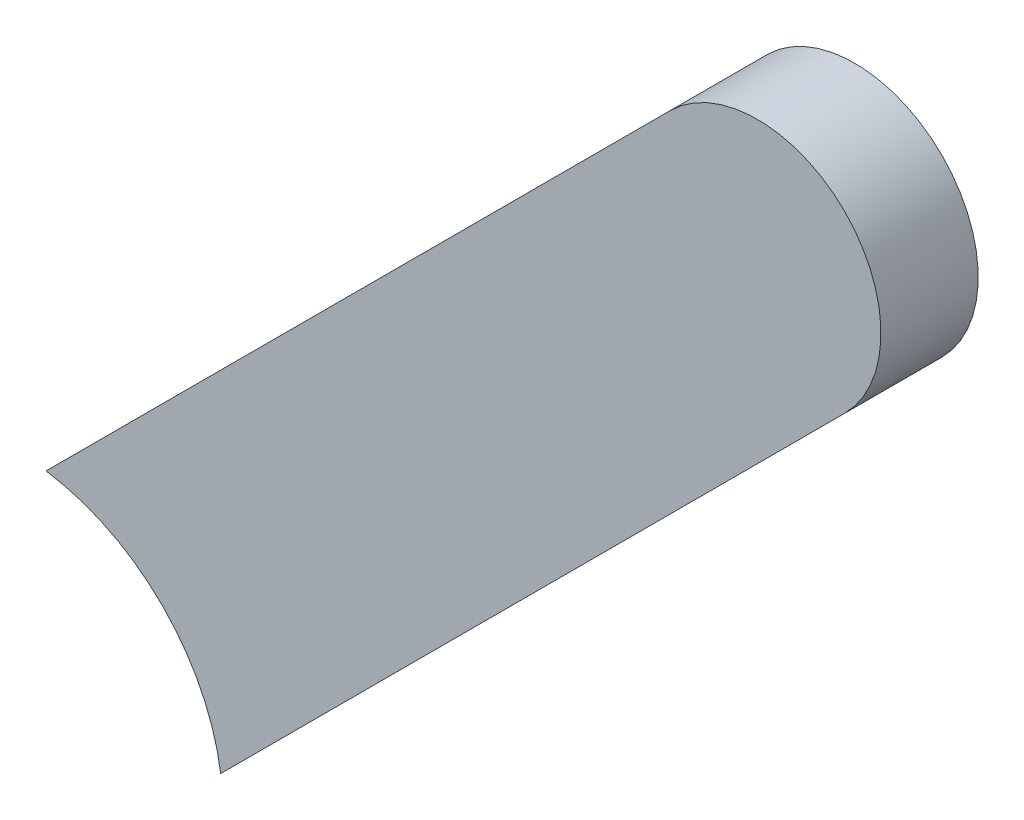
ISO-10303-21;
HEADER;
FILE_DESCRIPTION(('STEP AP214'),'2;1');
FILE_NAME('part.step','',(''),(''),'','','');
FILE_SCHEMA(('AUTOMOTIVE_DESIGN { 1 0 10303 214 1 1 1 1 }'));
ENDSEC;
DATA;
#1=APPLICATION_CONTEXT('core data for automotive mechanical design processes');
#2=APPLICATION_PROTOCOL_DEFINITION('international standard','automotive_design',2000,#1);
#3=PRODUCT_CONTEXT('',#1,'mechanical');
#4=PRODUCT('Part','Part','',(#3));
#5=PRODUCT_RELATED_PRODUCT_CATEGORY('part','',(#4));
#6=PRODUCT_DEFINITION_FORMATION('','',#4);
#7=PRODUCT_DEFINITION_CONTEXT('part definition',#1,'design');
#8=PRODUCT_DEFINITION('design','',#6,#7);
#9=PRODUCT_DEFINITION_SHAPE('','',#8);
#10=(LENGTH_UNIT() NAMED_UNIT(*) SI_UNIT(.MILLI.,.METRE.));
#11=(NAMED_UNIT(*) PLANE_ANGLE_UNIT() SI_UNIT($,.RADIAN.));
#12=(NAMED_UNIT(*) SI_UNIT($,.STERADIAN.) SOLID_ANGLE_UNIT());
#13=UNCERTAINTY_MEASURE_WITH_UNIT(LENGTH_MEASURE(1.E-05),#10,'distance_accuracy_value','');
#14=(GEOMETRIC_REPRESENTATION_CONTEXT(3) GLOBAL_UNCERTAINTY_ASSIGNED_CONTEXT((#13)) GLOBAL_UNIT_ASSIGNED_CONTEXT((#10,
#11,#12)) REPRESENTATION_CONTEXT('',''));
#15=CARTESIAN_POINT('',(0.,0.,0.));
#16=DIRECTION('',(0.,0.,1.));
#17=DIRECTION('',(1.,0.,0.));
#18=AXIS2_PLACEMENT_3D('',#15,#16,#17);
#19=CARTESIAN_POINT('',(137.45355071545,65.8473388354503,0.));
#20=DIRECTION('',(-0.707106781186548,0.707106781186548,0.));
#21=DIRECTION('',(0.707106781186548,0.707106781186548,0.));
#22=AXIS2_PLACEMENT_3D('',#19,#20,#21);
#23=PLANE('',#22);
#24=DIRECTION('',(0.707106781186548,0.707106781186548,0.));
#25=VECTOR('',#24,1.);
#26=CARTESIAN_POINT('',(137.21260594,65.60639406,0.1999996));
#27=LINE('',#26,#25);
#28=CARTESIAN_POINT('',(137.45355071545,65.8473388354503,0.1999996));
#29=VERTEX_POINT('',#28);
#30=CARTESIAN_POINT('',(138.73660594,67.13039406,0.1999996));
#31=VERTEX_POINT('',#30);
#32=EDGE_CURVE('E11',#29,#31,#27,.T.);
#33=ORIENTED_EDGE('',*,*,#32,.F.);
#34=DIRECTION('',(0.,0.,1.));
#35=VECTOR('',#34,1.);
#36=CARTESIAN_POINT('',(137.45355071545,65.8473388354503,0.));
#37=LINE('',#36,#35);
#38=CARTESIAN_POINT('',(137.45355071545,65.8473388354503,0.));
#39=VERTEX_POINT('',#38);
#40=EDGE_CURVE('E24',#39,#29,#37,.T.);
#41=ORIENTED_EDGE('',*,*,#40,.F.);
#42=DIRECTION('',(0.707106781186548,0.707106781186548,0.));
#43=VECTOR('',#42,1.);
#44=CARTESIAN_POINT('',(137.21260594,65.60639406,0.));
#45=LINE('',#44,#43);
#46=CARTESIAN_POINT('',(138.73660594,67.13039406,0.));
#47=VERTEX_POINT('',#46);
#48=EDGE_CURVE('E75',#39,#47,#45,.T.);
#49=ORIENTED_EDGE('',*,*,#48,.T.);
#50=DIRECTION('',(0.,0.,1.));
#51=VECTOR('',#50,1.);
#52=CARTESIAN_POINT('',(138.73660594,67.13039406,0.));
#53=LINE('',#52,#51);
#54=EDGE_CURVE('E37',#47,#31,#53,.T.);
#55=ORIENTED_EDGE('',*,*,#54,.T.);
#56=EDGE_LOOP('',(#33,#41,#49,#55));
#57=FACE_BOUND('',#56,.T.);
#58=ADVANCED_FACE('F17',(#57),#23,.F.);
#59=CARTESIAN_POINT('',(138.557,67.31,0.));
#60=DIRECTION('',(0.,0.,-1.));
#61=DIRECTION('',(0.707106781186576,-0.70710678118652,0.));
#62=AXIS2_PLACEMENT_3D('',#59,#60,#61);
#63=CYLINDRICAL_SURFACE('',#62,0.254001156230781);
#64=CARTESIAN_POINT('',(138.557,67.31,0.1999996));
#65=DIRECTION('',(0.,0.,1.));
#66=DIRECTION('',(0.707106781186576,-0.70710678118652,0.));
#67=AXIS2_PLACEMENT_3D('',#64,#65,#66);
#68=CIRCLE('',#67,0.254001156230781);
#69=CARTESIAN_POINT('',(138.37739406,67.48960594,0.1999996));
#70=VERTEX_POINT('',#69);
#71=EDGE_CURVE('E83',#31,#70,#68,.T.);
#72=ORIENTED_EDGE('',*,*,#71,.F.);
#73=ORIENTED_EDGE('',*,*,#54,.F.);
#74=CARTESIAN_POINT('',(138.557,67.31,0.));
#75=DIRECTION('',(0.,0.,1.));
#76=DIRECTION('',(0.707106781186576,-0.70710678118652,0.));
#77=AXIS2_PLACEMENT_3D('',#74,#75,#76);
#78=CIRCLE('',#77,0.254001156230781);
#79=CARTESIAN_POINT('',(138.37739406,67.48960594,0.));
#80=VERTEX_POINT('',#79);
#81=EDGE_CURVE('E81',#47,#80,#78,.T.);
#82=ORIENTED_EDGE('',*,*,#81,.T.);
#83=DIRECTION('',(0.,0.,1.));
#84=VECTOR('',#83,1.);
#85=CARTESIAN_POINT('',(138.37739406,67.48960594,0.));
#86=LINE('',#85,#84);
#87=EDGE_CURVE('E67',#80,#70,#86,.T.);
#88=ORIENTED_EDGE('',*,*,#87,.T.);
#89=EDGE_LOOP('',(#72,#73,#82,#88));
#90=FACE_BOUND('',#89,.T.);
#91=ADVANCED_FACE('F89',(#90),#63,.T.);
#92=CARTESIAN_POINT('',(138.37739406,67.48960594,0.));
#93=DIRECTION('',(0.707106781186554,-0.707106781186541,0.));
#94=DIRECTION('',(-0.707106781186541,-0.707106781186554,0.));
#95=AXIS2_PLACEMENT_3D('',#92,#93,#94);
#96=PLANE('',#95);
#97=DIRECTION('',(-0.707106781186541,-0.707106781186554,0.));
#98=VECTOR('',#97,1.);
#99=CARTESIAN_POINT('',(138.37739406,67.48960594,0.1999996));
#100=LINE('',#99,#98);
#101=CARTESIAN_POINT('',(137.09433883545,66.2065507154503,0.1999996));
#102=VERTEX_POINT('',#101);
#103=EDGE_CURVE('E71',#70,#102,#100,.T.);
#104=ORIENTED_EDGE('',*,*,#103,.F.);
#105=ORIENTED_EDGE('',*,*,#87,.F.);
#106=DIRECTION('',(-0.707106781186541,-0.707106781186554,0.));
#107=VECTOR('',#106,1.);
#108=CARTESIAN_POINT('',(138.37739406,67.48960594,0.));
#109=LINE('',#108,#107);
#110=CARTESIAN_POINT('',(137.09433883545,66.2065507154503,0.));
#111=VERTEX_POINT('',#110);
#112=EDGE_CURVE('E63',#80,#111,#109,.T.);
#113=ORIENTED_EDGE('',*,*,#112,.T.);
#114=DIRECTION('',(0.,0.,1.));
#115=VECTOR('',#114,1.);
#116=CARTESIAN_POINT('',(137.09433883545,66.2065507154503,0.));
#117=LINE('',#116,#115);
#118=EDGE_CURVE('E53',#111,#102,#117,.T.);
#119=ORIENTED_EDGE('',*,*,#118,.T.);
#120=EDGE_LOOP('',(#104,#105,#113,#119));
#121=FACE_BOUND('',#120,.T.);
#122=ADVANCED_FACE('F66',(#121),#96,.F.);
#123=CARTESIAN_POINT('',(137.033,65.786,0.));
#124=DIRECTION('',(0.,0.,-1.));
#125=DIRECTION('',(1.,0.,0.));
#126=AXIS2_PLACEMENT_3D('',#123,#124,#125);
#127=CYLINDRICAL_SURFACE('',#126,0.42500042);
#128=ORIENTED_EDGE('',*,*,#40,.T.);
#129=CARTESIAN_POINT('',(137.033,65.786,0.1999996));
#130=DIRECTION('',(0.,0.,1.));
#131=DIRECTION('',(1.,0.,0.));
#132=AXIS2_PLACEMENT_3D('',#129,#130,#131);
#133=CIRCLE('',#132,0.42500042);
#134=EDGE_CURVE('E59',#29,#102,#133,.T.);
#135=ORIENTED_EDGE('',*,*,#134,.T.);
#136=ORIENTED_EDGE('',*,*,#118,.F.);
#137=CARTESIAN_POINT('',(137.033,65.786,0.));
#138=DIRECTION('',(0.,0.,1.));
#139=DIRECTION('',(1.,0.,0.));
#140=AXIS2_PLACEMENT_3D('',#137,#138,#139);
#141=CIRCLE('',#140,0.42500042);
#142=EDGE_CURVE('E57',#39,#111,#141,.T.);
#143=ORIENTED_EDGE('',*,*,#142,.F.);
#144=EDGE_LOOP('',(#128,#135,#136,#143));
#145=FACE_BOUND('',#144,.T.);
#146=ADVANCED_FACE('F55',(#145),#127,.F.);
#147=CARTESIAN_POINT('',(137.21260594,65.60639406,0.));
#148=DIRECTION('',(0.,0.,-1.));
#149=DIRECTION('',(-1.,0.,0.));
#150=AXIS2_PLACEMENT_3D('',#147,#148,#149);
#151=PLANE('',#150);
#152=ORIENTED_EDGE('',*,*,#48,.F.);
#153=ORIENTED_EDGE('',*,*,#142,.T.);
#154=ORIENTED_EDGE('',*,*,#112,.F.);
#155=ORIENTED_EDGE('',*,*,#81,.F.);
#156=EDGE_LOOP('',(#152,#153,#154,#155));
#157=FACE_BOUND('',#156,.T.);
#158=ADVANCED_FACE('F74',(#157),#151,.T.);
#159=CARTESIAN_POINT('',(137.21260594,65.60639406,0.1999996));
#160=DIRECTION('',(0.,0.,-1.));
#161=DIRECTION('',(-1.,0.,0.));
#162=AXIS2_PLACEMENT_3D('',#159,#160,#161);
#163=PLANE('',#162);
#164=ORIENTED_EDGE('',*,*,#134,.F.);
#165=ORIENTED_EDGE('',*,*,#32,.T.);
#166=ORIENTED_EDGE('',*,*,#71,.T.);
#167=ORIENTED_EDGE('',*,*,#103,.T.);
#168=EDGE_LOOP('',(#164,#165,#166,#167));
#169=FACE_BOUND('',#168,.T.);
#170=ADVANCED_FACE('F91',(#169),#163,.F.);
#171=CLOSED_SHELL('',(#58,#91,#122,#146,#158,#170));
#172=MANIFOLD_SOLID_BREP('B1',#171);
#173=ADVANCED_BREP_SHAPE_REPRESENTATION('',(#18,#172),#14);
#174=SHAPE_DEFINITION_REPRESENTATION(#9,#173);
ENDSEC;
END-ISO-10303-21;
